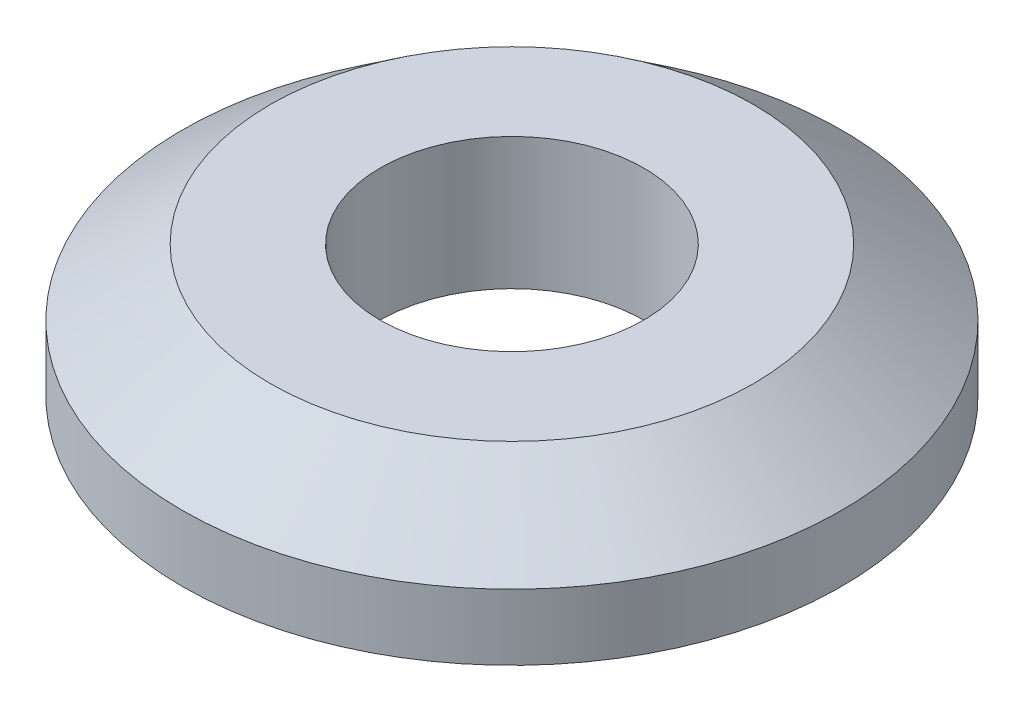
ISO-10303-21;
HEADER;
FILE_DESCRIPTION(('STEP AP214'),'2;1');
FILE_NAME('part.step','',(''),(''),'','','');
FILE_SCHEMA(('AUTOMOTIVE_DESIGN { 1 0 10303 214 1 1 1 1 }'));
ENDSEC;
DATA;
#1=APPLICATION_CONTEXT('core data for automotive mechanical design processes');
#2=APPLICATION_PROTOCOL_DEFINITION('international standard','automotive_design',2000,#1);
#3=PRODUCT_CONTEXT('',#1,'mechanical');
#4=PRODUCT('Part','Part','',(#3));
#5=PRODUCT_RELATED_PRODUCT_CATEGORY('part','',(#4));
#6=PRODUCT_DEFINITION_FORMATION('','',#4);
#7=PRODUCT_DEFINITION_CONTEXT('part definition',#1,'design');
#8=PRODUCT_DEFINITION('design','',#6,#7);
#9=PRODUCT_DEFINITION_SHAPE('','',#8);
#10=(LENGTH_UNIT() NAMED_UNIT(*) SI_UNIT(.MILLI.,.METRE.));
#11=(NAMED_UNIT(*) PLANE_ANGLE_UNIT() SI_UNIT($,.RADIAN.));
#12=(NAMED_UNIT(*) SI_UNIT($,.STERADIAN.) SOLID_ANGLE_UNIT());
#13=UNCERTAINTY_MEASURE_WITH_UNIT(LENGTH_MEASURE(1.E-05),#10,'distance_accuracy_value','');
#14=(GEOMETRIC_REPRESENTATION_CONTEXT(3) GLOBAL_UNCERTAINTY_ASSIGNED_CONTEXT((#13)) GLOBAL_UNIT_ASSIGNED_CONTEXT((#10,
#11,#12)) REPRESENTATION_CONTEXT('',''));
#15=CARTESIAN_POINT('',(0.,0.,0.));
#16=DIRECTION('',(0.,0.,1.));
#17=DIRECTION('',(1.,0.,0.));
#18=AXIS2_PLACEMENT_3D('',#15,#16,#17);
#19=CARTESIAN_POINT('',(0.,3.,0.));
#20=DIRECTION('',(0.,1.,0.));
#21=DIRECTION('',(0.,0.,1.));
#22=AXIS2_PLACEMENT_3D('',#19,#20,#21);
#23=PLANE('',#22);
#24=CARTESIAN_POINT('',(0.,3.,0.));
#25=DIRECTION('',(0.,1.,0.));
#26=DIRECTION('',(0.,0.,1.));
#27=AXIS2_PLACEMENT_3D('',#24,#25,#26);
#28=CIRCLE('',#27,5.49999999999998);
#29=CARTESIAN_POINT('',(0.,3.,5.49999999999998));
#30=VERTEX_POINT('',#29);
#31=EDGE_CURVE('E39',#30,#30,#28,.T.);
#32=ORIENTED_EDGE('',*,*,#31,.T.);
#33=EDGE_LOOP('',(#32));
#34=FACE_BOUND('',#33,.T.);
#35=CARTESIAN_POINT('',(0.,3.,0.));
#36=DIRECTION('',(0.,1.,0.));
#37=DIRECTION('',(0.,0.,1.));
#38=AXIS2_PLACEMENT_3D('',#35,#36,#37);
#39=CIRCLE('',#38,3.);
#40=CARTESIAN_POINT('',(0.,3.,3.));
#41=VERTEX_POINT('',#40);
#42=EDGE_CURVE('E47',#41,#41,#39,.T.);
#43=ORIENTED_EDGE('',*,*,#42,.F.);
#44=EDGE_LOOP('',(#43));
#45=FACE_BOUND('',#44,.T.);
#46=ADVANCED_FACE('F32',(#34,#45),#23,.T.);
#47=CARTESIAN_POINT('',(0.,0.,0.));
#48=DIRECTION('',(0.,1.,0.));
#49=DIRECTION('',(0.,0.,1.));
#50=AXIS2_PLACEMENT_3D('',#47,#48,#49);
#51=PLANE('',#50);
#52=CARTESIAN_POINT('',(0.,0.,0.));
#53=DIRECTION('',(0.,1.,0.));
#54=DIRECTION('',(0.,0.,1.));
#55=AXIS2_PLACEMENT_3D('',#52,#53,#54);
#56=CIRCLE('',#55,7.5);
#57=CARTESIAN_POINT('',(0.,0.,7.5));
#58=VERTEX_POINT('',#57);
#59=EDGE_CURVE('E43',#58,#58,#56,.T.);
#60=ORIENTED_EDGE('',*,*,#59,.F.);
#61=EDGE_LOOP('',(#60));
#62=FACE_BOUND('',#61,.T.);
#63=CARTESIAN_POINT('',(0.,0.,0.));
#64=DIRECTION('',(0.,1.,0.));
#65=DIRECTION('',(0.,0.,1.));
#66=AXIS2_PLACEMENT_3D('',#63,#64,#65);
#67=CIRCLE('',#66,3.);
#68=CARTESIAN_POINT('',(0.,0.,3.));
#69=VERTEX_POINT('',#68);
#70=EDGE_CURVE('E50',#69,#69,#67,.T.);
#71=ORIENTED_EDGE('',*,*,#70,.T.);
#72=EDGE_LOOP('',(#71));
#73=FACE_BOUND('',#72,.T.);
#74=ADVANCED_FACE('F60',(#62,#73),#51,.F.);
#75=CARTESIAN_POINT('',(0.,3.,0.));
#76=DIRECTION('',(0.,-1.,0.));
#77=DIRECTION('',(0.,0.,-1.));
#78=AXIS2_PLACEMENT_3D('',#75,#76,#77);
#79=CYLINDRICAL_SURFACE('',#78,7.5);
#80=CARTESIAN_POINT('',(0.,1.49999999999999,0.));
#81=DIRECTION('',(0.,1.,0.));
#82=DIRECTION('',(0.,0.,1.));
#83=AXIS2_PLACEMENT_3D('',#80,#81,#82);
#84=CIRCLE('',#83,7.5);
#85=CARTESIAN_POINT('',(0.,1.49999999999999,7.5));
#86=VERTEX_POINT('',#85);
#87=EDGE_CURVE('E10',#86,#86,#84,.F.);
#88=ORIENTED_EDGE('',*,*,#87,.T.);
#89=EDGE_LOOP('',(#88));
#90=FACE_BOUND('',#89,.T.);
#91=ORIENTED_EDGE('',*,*,#59,.T.);
#92=EDGE_LOOP('',(#91));
#93=FACE_BOUND('',#92,.T.);
#94=ADVANCED_FACE('F65',(#90,#93),#79,.T.);
#95=CARTESIAN_POINT('',(0.,3.,0.));
#96=DIRECTION('',(0.,-1.,0.));
#97=DIRECTION('',(0.,0.,-1.));
#98=AXIS2_PLACEMENT_3D('',#95,#96,#97);
#99=CYLINDRICAL_SURFACE('',#98,3.);
#100=ORIENTED_EDGE('',*,*,#42,.T.);
#101=EDGE_LOOP('',(#100));
#102=FACE_BOUND('',#101,.T.);
#103=ORIENTED_EDGE('',*,*,#70,.F.);
#104=EDGE_LOOP('',(#103));
#105=FACE_BOUND('',#104,.T.);
#106=ADVANCED_FACE('F56',(#102,#105),#99,.F.);
#107=CARTESIAN_POINT('',(0.,3.,0.));
#108=DIRECTION('',(0.,-1.,0.));
#109=DIRECTION('',(0.,0.,-1.));
#110=AXIS2_PLACEMENT_3D('',#107,#108,#109);
#111=CONICAL_SURFACE('',#110,5.49999999999998,0.927295218001613);
#112=ORIENTED_EDGE('',*,*,#87,.F.);
#113=EDGE_LOOP('',(#112));
#114=FACE_BOUND('',#113,.T.);
#115=ORIENTED_EDGE('',*,*,#31,.F.);
#116=EDGE_LOOP('',(#115));
#117=FACE_BOUND('',#116,.T.);
#118=ADVANCED_FACE('F34',(#114,#117),#111,.T.);
#119=CLOSED_SHELL('',(#46,#74,#94,#106,#118));
#120=MANIFOLD_SOLID_BREP('B2',#119);
#121=ADVANCED_BREP_SHAPE_REPRESENTATION('',(#18,#120),#14);
#122=SHAPE_DEFINITION_REPRESENTATION(#9,#121);
ENDSEC;
END-ISO-10303-21;
